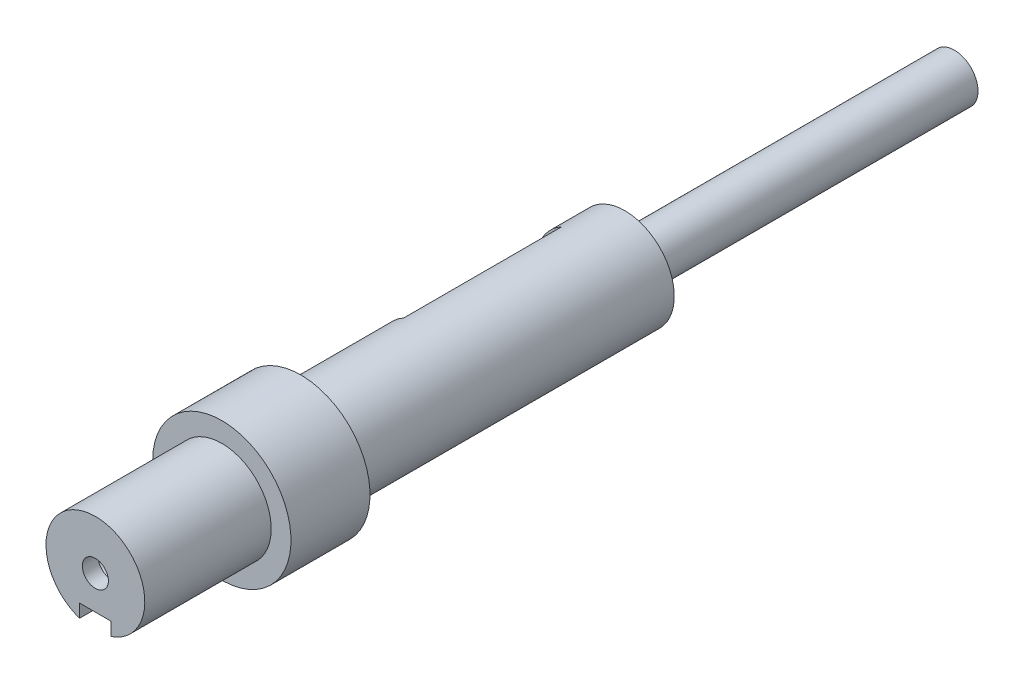
ISO-10303-21;
HEADER;
FILE_DESCRIPTION(('STEP AP214'),'2;1');
FILE_NAME('part.step','',(''),(''),'','','');
FILE_SCHEMA(('AUTOMOTIVE_DESIGN { 1 0 10303 214 1 1 1 1 }'));
ENDSEC;
DATA;
#1=APPLICATION_CONTEXT('core data for automotive mechanical design processes');
#2=APPLICATION_PROTOCOL_DEFINITION('international standard','automotive_design',2000,#1);
#3=PRODUCT_CONTEXT('',#1,'mechanical');
#4=PRODUCT('Part','Part','',(#3));
#5=PRODUCT_RELATED_PRODUCT_CATEGORY('part','',(#4));
#6=PRODUCT_DEFINITION_FORMATION('','',#4);
#7=PRODUCT_DEFINITION_CONTEXT('part definition',#1,'design');
#8=PRODUCT_DEFINITION('design','',#6,#7);
#9=PRODUCT_DEFINITION_SHAPE('','',#8);
#10=(LENGTH_UNIT() NAMED_UNIT(*) SI_UNIT(.MILLI.,.METRE.));
#11=(NAMED_UNIT(*) PLANE_ANGLE_UNIT() SI_UNIT($,.RADIAN.));
#12=(NAMED_UNIT(*) SI_UNIT($,.STERADIAN.) SOLID_ANGLE_UNIT());
#13=UNCERTAINTY_MEASURE_WITH_UNIT(LENGTH_MEASURE(1.E-05),#10,'distance_accuracy_value','');
#14=(GEOMETRIC_REPRESENTATION_CONTEXT(3) GLOBAL_UNCERTAINTY_ASSIGNED_CONTEXT((#13)) GLOBAL_UNIT_ASSIGNED_CONTEXT((#10,
#11,#12)) REPRESENTATION_CONTEXT('',''));
#15=CARTESIAN_POINT('',(0.,0.,0.));
#16=DIRECTION('',(0.,0.,1.));
#17=DIRECTION('',(1.,0.,0.));
#18=AXIS2_PLACEMENT_3D('',#15,#16,#17);
#19=CARTESIAN_POINT('',(0.,0.,0.));
#20=DIRECTION('',(0.,0.,1.));
#21=DIRECTION('',(1.,0.,0.));
#22=AXIS2_PLACEMENT_3D('',#19,#20,#21);
#23=PLANE('',#22);
#24=DIRECTION('',(1.,0.,0.));
#25=VECTOR('',#24,1.);
#26=CARTESIAN_POINT('',(0.,-8.5,0.));
#27=LINE('',#26,#25);
#28=CARTESIAN_POINT('',(-4.,-8.5,0.));
#29=VERTEX_POINT('',#28);
#30=CARTESIAN_POINT('',(4.,-8.5,0.));
#31=VERTEX_POINT('',#30);
#32=EDGE_CURVE('E52',#29,#31,#27,.T.);
#33=ORIENTED_EDGE('',*,*,#32,.F.);
#34=DIRECTION('',(0.,-1.,0.));
#35=VECTOR('',#34,1.);
#36=CARTESIAN_POINT('',(-4.,0.,0.));
#37=LINE('',#36,#35);
#38=CARTESIAN_POINT('',(-4.,-11.842719282327,0.));
#39=VERTEX_POINT('',#38);
#40=EDGE_CURVE('E145',#29,#39,#37,.T.);
#41=ORIENTED_EDGE('',*,*,#40,.T.);
#42=CARTESIAN_POINT('',(0.,0.,0.));
#43=DIRECTION('',(0.,0.,1.));
#44=DIRECTION('',(1.,0.,0.));
#45=AXIS2_PLACEMENT_3D('',#42,#43,#44);
#46=CIRCLE('',#45,12.5);
#47=CARTESIAN_POINT('',(4.,-11.842719282327,0.));
#48=VERTEX_POINT('',#47);
#49=EDGE_CURVE('E181',#39,#48,#46,.T.);
#50=ORIENTED_EDGE('',*,*,#49,.T.);
#51=DIRECTION('',(0.,-1.,0.));
#52=VECTOR('',#51,1.);
#53=CARTESIAN_POINT('',(4.00000000000001,0.,0.));
#54=LINE('',#53,#52);
#55=EDGE_CURVE('E57',#31,#48,#54,.T.);
#56=ORIENTED_EDGE('',*,*,#55,.F.);
#57=EDGE_LOOP('',(#33,#41,#50,#56));
#58=FACE_BOUND('',#57,.T.);
#59=ADVANCED_FACE('F35',(#58),#23,.T.);
#60=CARTESIAN_POINT('',(0.,0.,-22.));
#61=DIRECTION('',(0.,0.,-1.));
#62=DIRECTION('',(-1.,0.,0.));
#63=AXIS2_PLACEMENT_3D('',#60,#61,#62);
#64=CYLINDRICAL_SURFACE('',#63,17.5);
#65=CARTESIAN_POINT('',(0.,0.,-22.));
#66=DIRECTION('',(0.,0.,-1.));
#67=DIRECTION('',(-1.,0.,0.));
#68=AXIS2_PLACEMENT_3D('',#65,#66,#67);
#69=CIRCLE('',#68,17.5);
#70=CARTESIAN_POINT('',(-17.5,0.,-22.));
#71=VERTEX_POINT('',#70);
#72=EDGE_CURVE('E269',#71,#71,#69,.T.);
#73=CARTESIAN_POINT('',(0.,0.,-42.));
#74=DIRECTION('',(0.,0.,-1.));
#75=DIRECTION('',(-1.,0.,0.));
#76=AXIS2_PLACEMENT_3D('',#73,#74,#75);
#77=CIRCLE('',#76,17.5);
#78=CARTESIAN_POINT('',(-17.5,0.,-42.));
#79=VERTEX_POINT('',#78);
#80=EDGE_CURVE('E189',#79,#79,#77,.T.);
#81=CARTESIAN_POINT('',(-17.5,0.,-22.));
#82=CARTESIAN_POINT('',(-17.5,0.,-22.2083333333333));
#83=CARTESIAN_POINT('',(-17.5,0.,-22.4166666666667));
#84=CARTESIAN_POINT('',(-17.5,0.,-22.8333333333333));
#85=CARTESIAN_POINT('',(-17.5,0.,-23.0416666666667));
#86=CARTESIAN_POINT('',(-17.5,0.,-23.4583333333333));
#87=CARTESIAN_POINT('',(-17.5,0.,-23.6666666666667));
#88=CARTESIAN_POINT('',(-17.5,0.,-24.0833333333333));
#89=CARTESIAN_POINT('',(-17.5,0.,-24.2916666666667));
#90=CARTESIAN_POINT('',(-17.5,0.,-24.7083333333333));
#91=CARTESIAN_POINT('',(-17.5,0.,-24.9166666666667));
#92=CARTESIAN_POINT('',(-17.5,0.,-25.3333333333333));
#93=CARTESIAN_POINT('',(-17.5,0.,-25.5416666666667));
#94=CARTESIAN_POINT('',(-17.5,0.,-25.9583333333333));
#95=CARTESIAN_POINT('',(-17.5,0.,-26.1666666666667));
#96=CARTESIAN_POINT('',(-17.5,0.,-26.5833333333333));
#97=CARTESIAN_POINT('',(-17.5,0.,-26.7916666666667));
#98=CARTESIAN_POINT('',(-17.5,0.,-27.2083333333333));
#99=CARTESIAN_POINT('',(-17.5,0.,-27.4166666666667));
#100=CARTESIAN_POINT('',(-17.5,0.,-27.8333333333333));
#101=CARTESIAN_POINT('',(-17.5,0.,-28.0416666666667));
#102=CARTESIAN_POINT('',(-17.5,0.,-28.4583333333333));
#103=CARTESIAN_POINT('',(-17.5,0.,-28.6666666666667));
#104=CARTESIAN_POINT('',(-17.5,0.,-29.0833333333333));
#105=CARTESIAN_POINT('',(-17.5,0.,-29.2916666666667));
#106=CARTESIAN_POINT('',(-17.5,0.,-29.7083333333333));
#107=CARTESIAN_POINT('',(-17.5,0.,-29.9166666666667));
#108=CARTESIAN_POINT('',(-17.5,0.,-30.3333333333333));
#109=CARTESIAN_POINT('',(-17.5,0.,-30.5416666666667));
#110=CARTESIAN_POINT('',(-17.5,0.,-30.9583333333333));
#111=CARTESIAN_POINT('',(-17.5,0.,-31.1666666666667));
#112=CARTESIAN_POINT('',(-17.5,0.,-31.5833333333333));
#113=CARTESIAN_POINT('',(-17.5,0.,-31.7916666666667));
#114=CARTESIAN_POINT('',(-17.5,0.,-32.2083333333333));
#115=CARTESIAN_POINT('',(-17.5,0.,-32.4166666666667));
#116=CARTESIAN_POINT('',(-17.5,0.,-32.8333333333333));
#117=CARTESIAN_POINT('',(-17.5,0.,-33.0416666666667));
#118=CARTESIAN_POINT('',(-17.5,0.,-33.4583333333333));
#119=CARTESIAN_POINT('',(-17.5,0.,-33.6666666666667));
#120=CARTESIAN_POINT('',(-17.5,0.,-34.0833333333333));
#121=CARTESIAN_POINT('',(-17.5,0.,-34.2916666666667));
#122=CARTESIAN_POINT('',(-17.5,0.,-34.7083333333333));
#123=CARTESIAN_POINT('',(-17.5,0.,-34.9166666666667));
#124=CARTESIAN_POINT('',(-17.5,0.,-35.3333333333333));
#125=CARTESIAN_POINT('',(-17.5,0.,-35.5416666666667));
#126=CARTESIAN_POINT('',(-17.5,0.,-35.9583333333333));
#127=CARTESIAN_POINT('',(-17.5,0.,-36.1666666666667));
#128=CARTESIAN_POINT('',(-17.5,0.,-36.5833333333333));
#129=CARTESIAN_POINT('',(-17.5,0.,-36.7916666666667));
#130=CARTESIAN_POINT('',(-17.5,0.,-37.2083333333333));
#131=CARTESIAN_POINT('',(-17.5,0.,-37.4166666666667));
#132=CARTESIAN_POINT('',(-17.5,0.,-37.8333333333333));
#133=CARTESIAN_POINT('',(-17.5,0.,-38.0416666666667));
#134=CARTESIAN_POINT('',(-17.5,0.,-38.4583333333333));
#135=CARTESIAN_POINT('',(-17.5,0.,-38.6666666666667));
#136=CARTESIAN_POINT('',(-17.5,0.,-39.0833333333333));
#137=CARTESIAN_POINT('',(-17.5,0.,-39.2916666666667));
#138=CARTESIAN_POINT('',(-17.5,0.,-39.7083333333333));
#139=CARTESIAN_POINT('',(-17.5,0.,-39.9166666666667));
#140=CARTESIAN_POINT('',(-17.5,0.,-40.3333333333333));
#141=CARTESIAN_POINT('',(-17.5,0.,-40.5416666666667));
#142=CARTESIAN_POINT('',(-17.5,0.,-40.9583333333333));
#143=CARTESIAN_POINT('',(-17.5,0.,-41.1666666666667));
#144=CARTESIAN_POINT('',(-17.5,0.,-41.5833333333333));
#145=CARTESIAN_POINT('',(-17.5,0.,-41.7916666666667));
#146=CARTESIAN_POINT('',(-17.5,0.,-42.));
#147=B_SPLINE_CURVE_WITH_KNOTS('',3,(#81,#82,#83,#84,#85,#86,#87,#88,#89,#90,#91,#92,#93,#94,
#95,#96,#97,#98,#99,#100,#101,#102,#103,#104,#105,#106,#107,#108,#109,#110,#111,#112,#113,#114,
#115,#116,#117,#118,#119,#120,#121,#122,#123,#124,#125,#126,#127,#128,#129,#130,#131,#132,#133,
#134,#135,#136,#137,#138,#139,#140,#141,#142,#143,#144,#145,#146),.UNSPECIFIED.,.F.,.F.,(4,2,2,
2,2,2,2,2,2,2,2,2,2,2,2,2,2,2,2,2,2,2,2,2,2,2,2,2,2,2,2,2,4),(0.,0.625000000000004,1.25,
1.87500000000001,2.50000000000001,3.12500000000001,3.75000000000001,4.37500000000001,
5.00000000000001,5.62500000000001,6.25000000000001,6.87500000000001,7.50000000000001,
8.12500000000001,8.75000000000001,9.37500000000001,10.,10.625,11.25,11.875,12.5,13.125,13.75,
14.375,15.,15.625,16.25,16.875,17.5,18.125,18.75,19.375,20.),.UNSPECIFIED.);
#148=EDGE_CURVE('BSEAM277',#71,#79,#147,.T.);
#149=ORIENTED_EDGE('',*,*,#72,.T.);
#150=ORIENTED_EDGE('',*,*,#80,.F.);
#151=ORIENTED_EDGE('',*,*,#148,.T.);
#152=ORIENTED_EDGE('',*,*,#148,.F.);
#153=EDGE_LOOP('',(#149,#151,#150,#152));
#154=FACE_BOUND('',#153,.T.);
#155=ADVANCED_FACE('F277',(#154),#64,.T.);
#156=CARTESIAN_POINT('',(0.,0.,-124.));
#157=DIRECTION('',(0.,0.,1.));
#158=DIRECTION('',(1.,0.,0.));
#159=AXIS2_PLACEMENT_3D('',#156,#157,#158);
#160=CYLINDRICAL_SURFACE('',#159,12.5);
#161=ORIENTED_EDGE('',*,*,#49,.F.);
#162=DIRECTION('',(0.,0.,-1.));
#163=VECTOR('',#162,1.);
#164=CARTESIAN_POINT('',(-4.,-11.842719282327,10.));
#165=LINE('',#164,#163);
#166=CARTESIAN_POINT('',(-4.,-11.842719282327,10.));
#167=VERTEX_POINT('',#166);
#168=EDGE_CURVE('E165',#167,#39,#165,.T.);
#169=ORIENTED_EDGE('',*,*,#168,.F.);
#170=CARTESIAN_POINT('',(0.,0.,10.));
#171=DIRECTION('',(0.,0.,1.));
#172=DIRECTION('',(1.,0.,0.));
#173=AXIS2_PLACEMENT_3D('',#170,#171,#172);
#174=CIRCLE('',#173,12.5);
#175=CARTESIAN_POINT('',(4.,-11.842719282327,10.));
#176=VERTEX_POINT('',#175);
#177=EDGE_CURVE('E147',#176,#167,#174,.T.);
#178=ORIENTED_EDGE('',*,*,#177,.F.);
#179=DIRECTION('',(0.,0.,-1.));
#180=VECTOR('',#179,1.);
#181=CARTESIAN_POINT('',(4.,-11.842719282327,10.));
#182=LINE('',#181,#180);
#183=EDGE_CURVE('E161',#176,#48,#182,.T.);
#184=ORIENTED_EDGE('',*,*,#183,.T.);
#185=EDGE_LOOP('',(#161,#169,#178,#184));
#186=FACE_BOUND('',#185,.T.);
#187=CARTESIAN_POINT('',(0.,0.,-22.));
#188=DIRECTION('',(0.,0.,-1.));
#189=DIRECTION('',(-1.,0.,0.));
#190=AXIS2_PLACEMENT_3D('',#187,#188,#189);
#191=CIRCLE('',#190,12.5);
#192=CARTESIAN_POINT('',(-12.5,0.,-22.));
#193=VERTEX_POINT('',#192);
#194=EDGE_CURVE('E44',#193,#193,#191,.T.);
#195=ORIENTED_EDGE('',*,*,#194,.F.);
#196=EDGE_LOOP('',(#195));
#197=FACE_BOUND('',#196,.T.);
#198=ADVANCED_FACE('F183',(#186,#197),#160,.T.);
#199=CARTESIAN_POINT('',(0.,0.,-22.));
#200=DIRECTION('',(0.,0.,-1.));
#201=DIRECTION('',(-1.,0.,0.));
#202=AXIS2_PLACEMENT_3D('',#199,#200,#201);
#203=PLANE('',#202);
#204=ORIENTED_EDGE('',*,*,#194,.T.);
#205=EDGE_LOOP('',(#204));
#206=FACE_BOUND('',#205,.T.);
#207=ORIENTED_EDGE('',*,*,#72,.F.);
#208=EDGE_LOOP('',(#207));
#209=FACE_BOUND('',#208,.T.);
#210=ADVANCED_FACE('F285',(#206,#209),#203,.F.);
#211=CARTESIAN_POINT('',(0.,0.,-42.));
#212=DIRECTION('',(0.,0.,-1.));
#213=DIRECTION('',(-1.,0.,0.));
#214=AXIS2_PLACEMENT_3D('',#211,#212,#213);
#215=PLANE('',#214);
#216=CARTESIAN_POINT('',(0.,0.,-42.));
#217=DIRECTION('',(0.,0.,-1.));
#218=DIRECTION('',(-1.,0.,0.));
#219=AXIS2_PLACEMENT_3D('',#216,#217,#218);
#220=CIRCLE('',#219,12.5);
#221=CARTESIAN_POINT('',(-12.5,0.,-42.));
#222=VERTEX_POINT('',#221);
#223=EDGE_CURVE('E187',#222,#222,#220,.T.);
#224=ORIENTED_EDGE('',*,*,#223,.F.);
#225=EDGE_LOOP('',(#224));
#226=FACE_BOUND('',#225,.T.);
#227=ORIENTED_EDGE('',*,*,#80,.T.);
#228=EDGE_LOOP('',(#227));
#229=FACE_BOUND('',#228,.T.);
#230=ADVANCED_FACE('F275',(#226,#229),#215,.T.);
#231=CARTESIAN_POINT('',(3.39095353514196,1.5,-204.38));
#232=DIRECTION('',(1.,0.,0.));
#233=DIRECTION('',(0.,1.,0.));
#234=AXIS2_PLACEMENT_3D('',#231,#232,#233);
#235=PLANE('',#234);
#236=DIRECTION('',(0.,-1.,0.));
#237=VECTOR('',#236,1.);
#238=CARTESIAN_POINT('',(3.39095353514196,1.5,-207.38));
#239=LINE('',#238,#237);
#240=CARTESIAN_POINT('',(3.39095353514196,1.5,-207.38));
#241=VERTEX_POINT('',#240);
#242=CARTESIAN_POINT('',(3.39095353514196,-1.5,-207.38));
#243=VERTEX_POINT('',#242);
#244=EDGE_CURVE('E225',#241,#243,#239,.T.);
#245=ORIENTED_EDGE('',*,*,#244,.T.);
#246=DIRECTION('',(0.,0.,-1.));
#247=VECTOR('',#246,1.);
#248=CARTESIAN_POINT('',(3.39095353514196,-1.5,-204.38));
#249=LINE('',#248,#247);
#250=CARTESIAN_POINT('',(3.39095353514196,-1.5,-204.38));
#251=VERTEX_POINT('',#250);
#252=EDGE_CURVE('E216',#251,#243,#249,.T.);
#253=ORIENTED_EDGE('',*,*,#252,.F.);
#254=DIRECTION('',(0.,-1.,0.));
#255=VECTOR('',#254,1.);
#256=CARTESIAN_POINT('',(3.39095353514196,1.5,-204.38));
#257=LINE('',#256,#255);
#258=CARTESIAN_POINT('',(3.39095353514196,1.5,-204.38));
#259=VERTEX_POINT('',#258);
#260=EDGE_CURVE('E231',#259,#251,#257,.T.);
#261=ORIENTED_EDGE('',*,*,#260,.F.);
#262=DIRECTION('',(0.,0.,-1.));
#263=VECTOR('',#262,1.);
#264=CARTESIAN_POINT('',(3.39095353514196,1.5,-204.38));
#265=LINE('',#264,#263);
#266=EDGE_CURVE('E217',#259,#241,#265,.T.);
#267=ORIENTED_EDGE('',*,*,#266,.T.);
#268=EDGE_LOOP('',(#245,#253,#261,#267));
#269=FACE_BOUND('',#268,.T.);
#270=ADVANCED_FACE('F324',(#269),#235,.F.);
#271=CARTESIAN_POINT('',(-3.,5.85067254011662,-104.100000000005));
#272=DIRECTION('',(-1.,0.,0.));
#273=DIRECTION('',(0.,0.,1.));
#274=AXIS2_PLACEMENT_3D('',#271,#272,#273);
#275=CONICAL_SURFACE('',#274,2.24999999999999,1.0471975511966);
#276=CARTESIAN_POINT('',(-1.70096189432334,5.85067254011662,-104.100000000005));
#277=VERTEX_POINT('',#276);
#278=VERTEX_LOOP('',#277);
#279=FACE_BOUND('',#278,.T.);
#280=CARTESIAN_POINT('',(-3.,5.85067254011662,-104.100000000005));
#281=DIRECTION('',(-1.,0.,0.));
#282=DIRECTION('',(0.,0.,1.));
#283=AXIS2_PLACEMENT_3D('',#280,#281,#282);
#284=CIRCLE('',#283,2.24999999999999);
#285=CARTESIAN_POINT('',(-3.,5.85067254011662,-101.850000000005));
#286=VERTEX_POINT('',#285);
#287=EDGE_CURVE('E245',#286,#286,#284,.T.);
#288=ORIENTED_EDGE('',*,*,#287,.T.);
#289=EDGE_LOOP('',(#288));
#290=FACE_BOUND('',#289,.T.);
#291=ADVANCED_FACE('F316',(#279,#290),#275,.F.);
#292=CARTESIAN_POINT('',(-3.,5.85067254011673,-93.1000000000048));
#293=DIRECTION('',(-1.,0.,0.));
#294=DIRECTION('',(0.,0.,1.));
#295=AXIS2_PLACEMENT_3D('',#292,#293,#294);
#296=CONICAL_SURFACE('',#295,2.24999999999999,1.0471975511966);
#297=CARTESIAN_POINT('',(-1.70096189432334,5.85067254011673,-93.1000000000048));
#298=VERTEX_POINT('',#297);
#299=VERTEX_LOOP('',#298);
#300=FACE_BOUND('',#299,.T.);
#301=CARTESIAN_POINT('',(-3.,5.85067254011673,-93.1000000000048));
#302=DIRECTION('',(-1.,0.,0.));
#303=DIRECTION('',(0.,0.,1.));
#304=AXIS2_PLACEMENT_3D('',#301,#302,#303);
#305=CIRCLE('',#304,2.24999999999999);
#306=CARTESIAN_POINT('',(-3.,5.85067254011673,-90.8500000000048));
#307=VERTEX_POINT('',#306);
#308=EDGE_CURVE('E251',#307,#307,#305,.T.);
#309=ORIENTED_EDGE('',*,*,#308,.T.);
#310=EDGE_LOOP('',(#309));
#311=FACE_BOUND('',#310,.T.);
#312=ADVANCED_FACE('F308',(#300,#311),#296,.F.);
#313=CARTESIAN_POINT('',(-3.,-2.14932745988328,-93.1000000000048));
#314=DIRECTION('',(-1.,0.,0.));
#315=DIRECTION('',(0.,0.,1.));
#316=AXIS2_PLACEMENT_3D('',#313,#314,#315);
#317=CONICAL_SURFACE('',#316,2.24999999999999,1.0471975511966);
#318=CARTESIAN_POINT('',(-1.70096189432334,-2.14932745988328,-93.1000000000048));
#319=VERTEX_POINT('',#318);
#320=VERTEX_LOOP('',#319);
#321=FACE_BOUND('',#320,.T.);
#322=CARTESIAN_POINT('',(-3.,-2.14932745988328,-93.1000000000048));
#323=DIRECTION('',(-1.,0.,0.));
#324=DIRECTION('',(0.,0.,1.));
#325=AXIS2_PLACEMENT_3D('',#322,#323,#324);
#326=CIRCLE('',#325,2.24999999999999);
#327=CARTESIAN_POINT('',(-3.,-2.14932745988328,-90.8500000000048));
#328=VERTEX_POINT('',#327);
#329=EDGE_CURVE('E257',#328,#328,#326,.T.);
#330=ORIENTED_EDGE('',*,*,#329,.T.);
#331=EDGE_LOOP('',(#330));
#332=FACE_BOUND('',#331,.T.);
#333=ADVANCED_FACE('F300',(#321,#332),#317,.F.);
#334=CARTESIAN_POINT('',(-3.,5.85067254011684,-82.1000000000048));
#335=DIRECTION('',(-1.,0.,0.));
#336=DIRECTION('',(0.,0.,1.));
#337=AXIS2_PLACEMENT_3D('',#334,#335,#336);
#338=CONICAL_SURFACE('',#337,2.24999999999999,1.0471975511966);
#339=CARTESIAN_POINT('',(-1.70096189432334,5.85067254011684,-82.1000000000048));
#340=VERTEX_POINT('',#339);
#341=VERTEX_LOOP('',#340);
#342=FACE_BOUND('',#341,.T.);
#343=CARTESIAN_POINT('',(-3.,5.85067254011684,-82.1000000000048));
#344=DIRECTION('',(-1.,0.,0.));
#345=DIRECTION('',(0.,0.,1.));
#346=AXIS2_PLACEMENT_3D('',#343,#344,#345);
#347=CIRCLE('',#346,2.24999999999999);
#348=CARTESIAN_POINT('',(-3.,5.85067254011684,-79.8500000000048));
#349=VERTEX_POINT('',#348);
#350=EDGE_CURVE('E263',#349,#349,#347,.T.);
#351=ORIENTED_EDGE('',*,*,#350,.T.);
#352=EDGE_LOOP('',(#351));
#353=FACE_BOUND('',#352,.T.);
#354=ADVANCED_FACE('F296',(#342,#353),#338,.F.);
#355=CARTESIAN_POINT('',(3.39095353514196,1.5,-204.38));
#356=DIRECTION('',(0.,1.,0.));
#357=DIRECTION('',(0.,0.,1.));
#358=AXIS2_PLACEMENT_3D('',#355,#356,#357);
#359=PLANE('',#358);
#360=DIRECTION('',(1.,0.,0.));
#361=VECTOR('',#360,1.);
#362=CARTESIAN_POINT('',(0.,1.5,-207.38));
#363=LINE('',#362,#361);
#364=CARTESIAN_POINT('',(-5.80947501931113,1.5,-207.38));
#365=VERTEX_POINT('',#364);
#366=EDGE_CURVE('E199',#365,#241,#363,.T.);
#367=ORIENTED_EDGE('',*,*,#366,.T.);
#368=ORIENTED_EDGE('',*,*,#266,.F.);
#369=DIRECTION('',(1.,0.,0.));
#370=VECTOR('',#369,1.);
#371=CARTESIAN_POINT('',(3.39095353514196,1.5,-204.38));
#372=LINE('',#371,#370);
#373=CARTESIAN_POINT('',(-5.80947501931113,1.5,-204.38));
#374=VERTEX_POINT('',#373);
#375=EDGE_CURVE('E224',#374,#259,#372,.T.);
#376=ORIENTED_EDGE('',*,*,#375,.F.);
#377=DIRECTION('',(0.,0.,1.));
#378=VECTOR('',#377,1.);
#379=CARTESIAN_POINT('',(-5.80947501931113,1.5,-207.38));
#380=LINE('',#379,#378);
#381=EDGE_CURVE('E213',#365,#374,#380,.T.);
#382=ORIENTED_EDGE('',*,*,#381,.F.);
#383=EDGE_LOOP('',(#367,#368,#376,#382));
#384=FACE_BOUND('',#383,.T.);
#385=ADVANCED_FACE('F299',(#384),#359,.F.);
#386=CARTESIAN_POINT('',(0.,0.,-207.38));
#387=DIRECTION('',(0.,0.,-1.));
#388=DIRECTION('',(-1.,0.,0.));
#389=AXIS2_PLACEMENT_3D('',#386,#387,#388);
#390=PLANE('',#389);
#391=DIRECTION('',(-1.,0.,0.));
#392=VECTOR('',#391,1.);
#393=CARTESIAN_POINT('',(3.39095353514196,-1.5,-207.38));
#394=LINE('',#393,#392);
#395=CARTESIAN_POINT('',(-5.80947501931113,-1.5,-207.38));
#396=VERTEX_POINT('',#395);
#397=EDGE_CURVE('E222',#243,#396,#394,.T.);
#398=ORIENTED_EDGE('',*,*,#397,.F.);
#399=ORIENTED_EDGE('',*,*,#244,.F.);
#400=ORIENTED_EDGE('',*,*,#366,.F.);
#401=CARTESIAN_POINT('',(0.,0.,-207.38));
#402=DIRECTION('',(0.,0.,-1.));
#403=DIRECTION('',(-1.,0.,0.));
#404=AXIS2_PLACEMENT_3D('',#401,#402,#403);
#405=CIRCLE('',#404,6.);
#406=EDGE_CURVE('E204',#365,#396,#405,.T.);
#407=ORIENTED_EDGE('',*,*,#406,.T.);
#408=EDGE_LOOP('',(#398,#399,#400,#407));
#409=FACE_BOUND('',#408,.T.);
#410=ADVANCED_FACE('F345',(#409),#390,.T.);
#411=CARTESIAN_POINT('',(3.39095353514196,-1.5,-204.38));
#412=DIRECTION('',(0.,-1.,0.));
#413=DIRECTION('',(0.,0.,-1.));
#414=AXIS2_PLACEMENT_3D('',#411,#412,#413);
#415=PLANE('',#414);
#416=DIRECTION('',(-1.,0.,0.));
#417=VECTOR('',#416,1.);
#418=CARTESIAN_POINT('',(3.39095353514196,-1.5,-204.38));
#419=LINE('',#418,#417);
#420=CARTESIAN_POINT('',(-5.80947501931113,-1.5,-204.38));
#421=VERTEX_POINT('',#420);
#422=EDGE_CURVE('E220',#251,#421,#419,.T.);
#423=ORIENTED_EDGE('',*,*,#422,.F.);
#424=ORIENTED_EDGE('',*,*,#252,.T.);
#425=ORIENTED_EDGE('',*,*,#397,.T.);
#426=DIRECTION('',(0.,0.,1.));
#427=VECTOR('',#426,1.);
#428=CARTESIAN_POINT('',(-5.80947501931113,-1.5,-207.38));
#429=LINE('',#428,#427);
#430=EDGE_CURVE('E208',#421,#396,#429,.F.);
#431=ORIENTED_EDGE('',*,*,#430,.F.);
#432=EDGE_LOOP('',(#423,#424,#425,#431));
#433=FACE_BOUND('',#432,.T.);
#434=ADVANCED_FACE('F341',(#433),#415,.F.);
#435=CARTESIAN_POINT('',(0.,0.,-204.38));
#436=DIRECTION('',(0.,0.,-1.));
#437=DIRECTION('',(-1.,0.,0.));
#438=AXIS2_PLACEMENT_3D('',#435,#436,#437);
#439=PLANE('',#438);
#440=CARTESIAN_POINT('',(0.,0.,-204.38));
#441=DIRECTION('',(0.,0.,-1.));
#442=DIRECTION('',(-1.,0.,0.));
#443=AXIS2_PLACEMENT_3D('',#440,#441,#442);
#444=CIRCLE('',#443,6.);
#445=EDGE_CURVE('E197',#421,#374,#444,.T.);
#446=ORIENTED_EDGE('',*,*,#445,.T.);
#447=ORIENTED_EDGE('',*,*,#375,.T.);
#448=ORIENTED_EDGE('',*,*,#260,.T.);
#449=ORIENTED_EDGE('',*,*,#422,.T.);
#450=EDGE_LOOP('',(#446,#447,#448,#449));
#451=FACE_BOUND('',#450,.T.);
#452=ADVANCED_FACE('F320',(#451),#439,.T.);
#453=CARTESIAN_POINT('',(-6.,5.85067254011662,-104.100000000005));
#454=DIRECTION('',(-1.,0.,0.));
#455=DIRECTION('',(0.,0.,1.));
#456=AXIS2_PLACEMENT_3D('',#453,#454,#455);
#457=CYLINDRICAL_SURFACE('',#456,2.24999999999999);
#458=ORIENTED_EDGE('',*,*,#287,.F.);
#459=EDGE_LOOP('',(#458));
#460=FACE_BOUND('',#459,.T.);
#461=CARTESIAN_POINT('',(-6.,5.85067254011662,-104.100000000005));
#462=DIRECTION('',(-1.,0.,0.));
#463=DIRECTION('',(0.,0.,1.));
#464=AXIS2_PLACEMENT_3D('',#461,#462,#463);
#465=CIRCLE('',#464,2.24999999999999);
#466=CARTESIAN_POINT('',(-6.,5.85067254011662,-101.850000000005));
#467=VERTEX_POINT('',#466);
#468=EDGE_CURVE('E248',#467,#467,#465,.T.);
#469=ORIENTED_EDGE('',*,*,#468,.T.);
#470=EDGE_LOOP('',(#469));
#471=FACE_BOUND('',#470,.T.);
#472=ADVANCED_FACE('F312',(#460,#471),#457,.F.);
#473=CARTESIAN_POINT('',(-6.,5.85067254011673,-93.1000000000048));
#474=DIRECTION('',(-1.,0.,0.));
#475=DIRECTION('',(0.,0.,1.));
#476=AXIS2_PLACEMENT_3D('',#473,#474,#475);
#477=CYLINDRICAL_SURFACE('',#476,2.24999999999999);
#478=ORIENTED_EDGE('',*,*,#308,.F.);
#479=EDGE_LOOP('',(#478));
#480=FACE_BOUND('',#479,.T.);
#481=CARTESIAN_POINT('',(-6.,5.85067254011673,-93.1000000000048));
#482=DIRECTION('',(-1.,0.,0.));
#483=DIRECTION('',(0.,0.,1.));
#484=AXIS2_PLACEMENT_3D('',#481,#482,#483);
#485=CIRCLE('',#484,2.24999999999999);
#486=CARTESIAN_POINT('',(-6.,5.85067254011673,-90.8500000000048));
#487=VERTEX_POINT('',#486);
#488=EDGE_CURVE('E254',#487,#487,#485,.T.);
#489=ORIENTED_EDGE('',*,*,#488,.T.);
#490=EDGE_LOOP('',(#489));
#491=FACE_BOUND('',#490,.T.);
#492=ADVANCED_FACE('F304',(#480,#491),#477,.F.);
#493=CARTESIAN_POINT('',(-6.,-2.14932745988328,-93.1000000000048));
#494=DIRECTION('',(-1.,0.,0.));
#495=DIRECTION('',(0.,0.,1.));
#496=AXIS2_PLACEMENT_3D('',#493,#494,#495);
#497=CYLINDRICAL_SURFACE('',#496,2.24999999999999);
#498=ORIENTED_EDGE('',*,*,#329,.F.);
#499=EDGE_LOOP('',(#498));
#500=FACE_BOUND('',#499,.T.);
#501=CARTESIAN_POINT('',(-6.,-2.14932745988328,-93.1000000000048));
#502=DIRECTION('',(-1.,0.,0.));
#503=DIRECTION('',(0.,0.,1.));
#504=AXIS2_PLACEMENT_3D('',#501,#502,#503);
#505=CIRCLE('',#504,2.24999999999999);
#506=CARTESIAN_POINT('',(-6.,-2.14932745988328,-90.8500000000048));
#507=VERTEX_POINT('',#506);
#508=EDGE_CURVE('E260',#507,#507,#505,.T.);
#509=ORIENTED_EDGE('',*,*,#508,.T.);
#510=EDGE_LOOP('',(#509));
#511=FACE_BOUND('',#510,.T.);
#512=ADVANCED_FACE('F294',(#500,#511),#497,.F.);
#513=CARTESIAN_POINT('',(-6.,5.85067254011684,-82.1000000000048));
#514=DIRECTION('',(-1.,0.,0.));
#515=DIRECTION('',(0.,0.,1.));
#516=AXIS2_PLACEMENT_3D('',#513,#514,#515);
#517=CYLINDRICAL_SURFACE('',#516,2.24999999999999);
#518=ORIENTED_EDGE('',*,*,#350,.F.);
#519=EDGE_LOOP('',(#518));
#520=FACE_BOUND('',#519,.T.);
#521=CARTESIAN_POINT('',(-6.,5.85067254011684,-82.1000000000048));
#522=DIRECTION('',(-1.,0.,0.));
#523=DIRECTION('',(0.,0.,1.));
#524=AXIS2_PLACEMENT_3D('',#521,#522,#523);
#525=CIRCLE('',#524,2.24999999999999);
#526=CARTESIAN_POINT('',(-6.,5.85067254011684,-79.8500000000048));
#527=VERTEX_POINT('',#526);
#528=EDGE_CURVE('E266',#527,#527,#525,.T.);
#529=ORIENTED_EDGE('',*,*,#528,.T.);
#530=EDGE_LOOP('',(#529));
#531=FACE_BOUND('',#530,.T.);
#532=ADVANCED_FACE('F290',(#520,#531),#517,.F.);
#533=CARTESIAN_POINT('',(0.,0.,-207.38));
#534=DIRECTION('',(0.,0.,1.));
#535=DIRECTION('',(1.,0.,0.));
#536=AXIS2_PLACEMENT_3D('',#533,#534,#535);
#537=CYLINDRICAL_SURFACE('',#536,6.);
#538=ORIENTED_EDGE('',*,*,#445,.F.);
#539=ORIENTED_EDGE('',*,*,#430,.T.);
#540=ORIENTED_EDGE('',*,*,#406,.F.);
#541=ORIENTED_EDGE('',*,*,#381,.T.);
#542=EDGE_LOOP('',(#538,#539,#540,#541));
#543=FACE_BOUND('',#542,.T.);
#544=CARTESIAN_POINT('',(0.,0.,-124.));
#545=DIRECTION('',(0.,0.,-1.));
#546=DIRECTION('',(-1.,0.,0.));
#547=AXIS2_PLACEMENT_3D('',#544,#545,#546);
#548=CIRCLE('',#547,6.);
#549=CARTESIAN_POINT('',(-6.,0.,-124.));
#550=VERTEX_POINT('',#549);
#551=EDGE_CURVE('E205',#550,#550,#548,.T.);
#552=ORIENTED_EDGE('',*,*,#551,.T.);
#553=EDGE_LOOP('',(#552));
#554=FACE_BOUND('',#553,.T.);
#555=ADVANCED_FACE('F293',(#543,#554),#537,.T.);
#556=CARTESIAN_POINT('',(0.,0.,-114.));
#557=DIRECTION('',(0.,0.,-1.));
#558=DIRECTION('',(-1.,0.,0.));
#559=AXIS2_PLACEMENT_3D('',#556,#557,#558);
#560=PLANE('',#559);
#561=CARTESIAN_POINT('',(0.,0.,-114.));
#562=DIRECTION('',(0.,0.,-1.));
#563=DIRECTION('',(-1.,0.,0.));
#564=AXIS2_PLACEMENT_3D('',#561,#562,#563);
#565=CIRCLE('',#564,12.5);
#566=CARTESIAN_POINT('',(-6.,-10.9658560997307,-114.));
#567=VERTEX_POINT('',#566);
#568=CARTESIAN_POINT('',(-6.,10.9658560997307,-114.));
#569=VERTEX_POINT('',#568);
#570=EDGE_CURVE('E242',#567,#569,#565,.T.);
#571=ORIENTED_EDGE('',*,*,#570,.F.);
#572=DIRECTION('',(0.,1.,0.));
#573=VECTOR('',#572,1.);
#574=CARTESIAN_POINT('',(-6.,10.9658560997307,-114.));
#575=LINE('',#574,#573);
#576=EDGE_CURVE('E194',#567,#569,#575,.T.);
#577=ORIENTED_EDGE('',*,*,#576,.T.);
#578=EDGE_LOOP('',(#571,#577));
#579=FACE_BOUND('',#578,.T.);
#580=ADVANCED_FACE('F326',(#579),#560,.F.);
#581=CARTESIAN_POINT('',(0.,0.,-74.));
#582=DIRECTION('',(0.,0.,1.));
#583=DIRECTION('',(1.,0.,0.));
#584=AXIS2_PLACEMENT_3D('',#581,#582,#583);
#585=PLANE('',#584);
#586=CARTESIAN_POINT('',(0.,0.,-74.));
#587=DIRECTION('',(0.,0.,1.));
#588=DIRECTION('',(1.,0.,0.));
#589=AXIS2_PLACEMENT_3D('',#586,#587,#588);
#590=CIRCLE('',#589,12.5);
#591=CARTESIAN_POINT('',(-6.,10.9658560997307,-74.));
#592=VERTEX_POINT('',#591);
#593=CARTESIAN_POINT('',(-6.,-10.9658560997307,-74.));
#594=VERTEX_POINT('',#593);
#595=EDGE_CURVE('E11',#592,#594,#590,.T.);
#596=ORIENTED_EDGE('',*,*,#595,.F.);
#597=DIRECTION('',(0.,-1.,0.));
#598=VECTOR('',#597,1.);
#599=CARTESIAN_POINT('',(-6.,10.9658560997307,-74.));
#600=LINE('',#599,#598);
#601=EDGE_CURVE('E237',#592,#594,#600,.T.);
#602=ORIENTED_EDGE('',*,*,#601,.T.);
#603=EDGE_LOOP('',(#596,#602));
#604=FACE_BOUND('',#603,.T.);
#605=ADVANCED_FACE('F329',(#604),#585,.F.);
#606=CARTESIAN_POINT('',(-6.,10.9658560997307,-74.));
#607=DIRECTION('',(1.,0.,0.));
#608=DIRECTION('',(0.,0.,-1.));
#609=AXIS2_PLACEMENT_3D('',#606,#607,#608);
#610=PLANE('',#609);
#611=ORIENTED_EDGE('',*,*,#528,.F.);
#612=EDGE_LOOP('',(#611));
#613=FACE_BOUND('',#612,.T.);
#614=ORIENTED_EDGE('',*,*,#508,.F.);
#615=EDGE_LOOP('',(#614));
#616=FACE_BOUND('',#615,.T.);
#617=ORIENTED_EDGE('',*,*,#488,.F.);
#618=EDGE_LOOP('',(#617));
#619=FACE_BOUND('',#618,.T.);
#620=ORIENTED_EDGE('',*,*,#468,.F.);
#621=EDGE_LOOP('',(#620));
#622=FACE_BOUND('',#621,.T.);
#623=ORIENTED_EDGE('',*,*,#576,.F.);
#624=DIRECTION('',(0.,0.,-1.));
#625=VECTOR('',#624,1.);
#626=CARTESIAN_POINT('',(-6.,-10.9658560997307,-74.));
#627=LINE('',#626,#625);
#628=EDGE_CURVE('E228',#594,#567,#627,.T.);
#629=ORIENTED_EDGE('',*,*,#628,.F.);
#630=ORIENTED_EDGE('',*,*,#601,.F.);
#631=DIRECTION('',(0.,0.,-1.));
#632=VECTOR('',#631,1.);
#633=CARTESIAN_POINT('',(-6.,10.9658560997307,-74.));
#634=LINE('',#633,#632);
#635=EDGE_CURVE('E235',#592,#569,#634,.T.);
#636=ORIENTED_EDGE('',*,*,#635,.T.);
#637=EDGE_LOOP('',(#623,#629,#630,#636));
#638=FACE_BOUND('',#637,.T.);
#639=ADVANCED_FACE('F333',(#613,#616,#619,#622,#638),#610,.F.);
#640=CARTESIAN_POINT('',(0.,0.,-124.));
#641=DIRECTION('',(0.,0.,-1.));
#642=DIRECTION('',(-1.,0.,0.));
#643=AXIS2_PLACEMENT_3D('',#640,#641,#642);
#644=PLANE('',#643);
#645=CARTESIAN_POINT('',(0.,0.,-124.));
#646=DIRECTION('',(0.,0.,-1.));
#647=DIRECTION('',(-1.,0.,0.));
#648=AXIS2_PLACEMENT_3D('',#645,#646,#647);
#649=CIRCLE('',#648,12.5);
#650=CARTESIAN_POINT('',(-12.5,0.,-124.));
#651=VERTEX_POINT('',#650);
#652=EDGE_CURVE('E201',#651,#651,#649,.T.);
#653=ORIENTED_EDGE('',*,*,#652,.T.);
#654=EDGE_LOOP('',(#653));
#655=FACE_BOUND('',#654,.T.);
#656=ORIENTED_EDGE('',*,*,#551,.F.);
#657=EDGE_LOOP('',(#656));
#658=FACE_BOUND('',#657,.T.);
#659=ADVANCED_FACE('F337',(#655,#658),#644,.T.);
#660=ORIENTED_EDGE('',*,*,#652,.F.);
#661=EDGE_LOOP('',(#660));
#662=FACE_BOUND('',#661,.T.);
#663=ORIENTED_EDGE('',*,*,#635,.F.);
#664=ORIENTED_EDGE('',*,*,#595,.T.);
#665=ORIENTED_EDGE('',*,*,#628,.T.);
#666=ORIENTED_EDGE('',*,*,#570,.T.);
#667=EDGE_LOOP('',(#663,#664,#665,#666));
#668=FACE_BOUND('',#667,.T.);
#669=ORIENTED_EDGE('',*,*,#223,.T.);
#670=EDGE_LOOP('',(#669));
#671=FACE_BOUND('',#670,.T.);
#672=ADVANCED_FACE('F37',(#662,#668,#671),#160,.T.);
#673=CARTESIAN_POINT('',(0.,-8.5,10.));
#674=DIRECTION('',(0.,1.,0.));
#675=DIRECTION('',(0.,0.,1.));
#676=AXIS2_PLACEMENT_3D('',#673,#674,#675);
#677=PLANE('',#676);
#678=ORIENTED_EDGE('',*,*,#32,.T.);
#679=DIRECTION('',(0.,0.,-1.));
#680=VECTOR('',#679,1.);
#681=CARTESIAN_POINT('',(4.,-8.5,10.));
#682=LINE('',#681,#680);
#683=CARTESIAN_POINT('',(4.,-8.5,10.));
#684=VERTEX_POINT('',#683);
#685=EDGE_CURVE('E164',#684,#31,#682,.T.);
#686=ORIENTED_EDGE('',*,*,#685,.F.);
#687=DIRECTION('',(1.,0.,0.));
#688=VECTOR('',#687,1.);
#689=CARTESIAN_POINT('',(0.,-8.5,10.));
#690=LINE('',#689,#688);
#691=CARTESIAN_POINT('',(-4.,-8.5,10.));
#692=VERTEX_POINT('',#691);
#693=EDGE_CURVE('E141',#692,#684,#690,.T.);
#694=ORIENTED_EDGE('',*,*,#693,.F.);
#695=DIRECTION('',(0.,0.,-1.));
#696=VECTOR('',#695,1.);
#697=CARTESIAN_POINT('',(-4.,-8.5,10.));
#698=LINE('',#697,#696);
#699=EDGE_CURVE('E151',#692,#29,#698,.T.);
#700=ORIENTED_EDGE('',*,*,#699,.T.);
#701=EDGE_LOOP('',(#678,#686,#694,#700));
#702=FACE_BOUND('',#701,.T.);
#703=ADVANCED_FACE('F176',(#702),#677,.F.);
#704=CARTESIAN_POINT('',(4.00000000000001,0.,10.));
#705=DIRECTION('',(1.,0.,0.));
#706=DIRECTION('',(0.,1.,0.));
#707=AXIS2_PLACEMENT_3D('',#704,#705,#706);
#708=PLANE('',#707);
#709=ORIENTED_EDGE('',*,*,#55,.T.);
#710=ORIENTED_EDGE('',*,*,#183,.F.);
#711=DIRECTION('',(0.,-1.,0.));
#712=VECTOR('',#711,1.);
#713=CARTESIAN_POINT('',(4.00000000000001,0.,10.));
#714=LINE('',#713,#712);
#715=EDGE_CURVE('E144',#684,#176,#714,.T.);
#716=ORIENTED_EDGE('',*,*,#715,.F.);
#717=ORIENTED_EDGE('',*,*,#685,.T.);
#718=EDGE_LOOP('',(#709,#710,#716,#717));
#719=FACE_BOUND('',#718,.T.);
#720=ADVANCED_FACE('F381',(#719),#708,.F.);
#721=CARTESIAN_POINT('',(-4.,0.,10.));
#722=DIRECTION('',(1.,0.,0.));
#723=DIRECTION('',(0.,1.,0.));
#724=AXIS2_PLACEMENT_3D('',#721,#722,#723);
#725=PLANE('',#724);
#726=ORIENTED_EDGE('',*,*,#40,.F.);
#727=ORIENTED_EDGE('',*,*,#699,.F.);
#728=DIRECTION('',(0.,-1.,0.));
#729=VECTOR('',#728,1.);
#730=CARTESIAN_POINT('',(-4.,0.,10.));
#731=LINE('',#730,#729);
#732=EDGE_CURVE('E149',#692,#167,#731,.T.);
#733=ORIENTED_EDGE('',*,*,#732,.T.);
#734=ORIENTED_EDGE('',*,*,#168,.T.);
#735=EDGE_LOOP('',(#726,#727,#733,#734));
#736=FACE_BOUND('',#735,.T.);
#737=ADVANCED_FACE('F179',(#736),#725,.T.);
#738=CARTESIAN_POINT('',(0.,0.,10.));
#739=DIRECTION('',(0.,0.,1.));
#740=DIRECTION('',(1.,0.,0.));
#741=AXIS2_PLACEMENT_3D('',#738,#739,#740);
#742=PLANE('',#741);
#743=CARTESIAN_POINT('',(0.,0.,10.));
#744=DIRECTION('',(0.,0.,1.));
#745=DIRECTION('',(1.,0.,0.));
#746=AXIS2_PLACEMENT_3D('',#743,#744,#745);
#747=CIRCLE('',#746,3.29999999999999);
#748=CARTESIAN_POINT('',(3.29999999999999,0.,10.));
#749=VERTEX_POINT('',#748);
#750=EDGE_CURVE('E135',#749,#749,#747,.T.);
#751=ORIENTED_EDGE('',*,*,#750,.F.);
#752=EDGE_LOOP('',(#751));
#753=FACE_BOUND('',#752,.T.);
#754=ORIENTED_EDGE('',*,*,#693,.T.);
#755=ORIENTED_EDGE('',*,*,#715,.T.);
#756=ORIENTED_EDGE('',*,*,#177,.T.);
#757=ORIENTED_EDGE('',*,*,#732,.F.);
#758=EDGE_LOOP('',(#754,#755,#756,#757));
#759=FACE_BOUND('',#758,.T.);
#760=ADVANCED_FACE('F129',(#753,#759),#742,.T.);
#761=CARTESIAN_POINT('',(0.,0.,6.));
#762=DIRECTION('',(0.,0.,1.));
#763=DIRECTION('',(1.,0.,0.));
#764=AXIS2_PLACEMENT_3D('',#761,#762,#763);
#765=CONICAL_SURFACE('',#764,3.3,1.0471975511966);
#766=CARTESIAN_POINT('',(0.,0.,4.09474411167423));
#767=VERTEX_POINT('',#766);
#768=VERTEX_LOOP('',#767);
#769=FACE_BOUND('',#768,.T.);
#770=CARTESIAN_POINT('',(0.,0.,6.));
#771=DIRECTION('',(0.,0.,1.));
#772=DIRECTION('',(1.,0.,0.));
#773=AXIS2_PLACEMENT_3D('',#770,#771,#772);
#774=CIRCLE('',#773,3.3);
#775=CARTESIAN_POINT('',(3.3,0.,6.));
#776=VERTEX_POINT('',#775);
#777=EDGE_CURVE('E133',#776,#776,#774,.T.);
#778=ORIENTED_EDGE('',*,*,#777,.T.);
#779=EDGE_LOOP('',(#778));
#780=FACE_BOUND('',#779,.T.);
#781=ADVANCED_FACE('F125',(#769,#780),#765,.F.);
#782=CARTESIAN_POINT('',(0.,0.,10.));
#783=DIRECTION('',(0.,0.,1.));
#784=DIRECTION('',(1.,0.,0.));
#785=AXIS2_PLACEMENT_3D('',#782,#783,#784);
#786=CYLINDRICAL_SURFACE('',#785,3.29999999999999);
#787=ORIENTED_EDGE('',*,*,#777,.F.);
#788=EDGE_LOOP('',(#787));
#789=FACE_BOUND('',#788,.T.);
#790=ORIENTED_EDGE('',*,*,#750,.T.);
#791=EDGE_LOOP('',(#790));
#792=FACE_BOUND('',#791,.T.);
#793=ADVANCED_FACE('F128',(#789,#792),#786,.F.);
#794=CLOSED_SHELL('',(#59,#155,#198,#210,#230,#270,#291,#312,#333,#354,#385,#410,#434,#452,#472,
#492,#512,#532,#555,#580,#605,#639,#659,#672,#703,#720,#737,#760,#781,#793));
#795=MANIFOLD_SOLID_BREP('B2',#794);
#796=ADVANCED_BREP_SHAPE_REPRESENTATION('',(#18,#795),#14);
#797=SHAPE_DEFINITION_REPRESENTATION(#9,#796);
ENDSEC;
END-ISO-10303-21;
